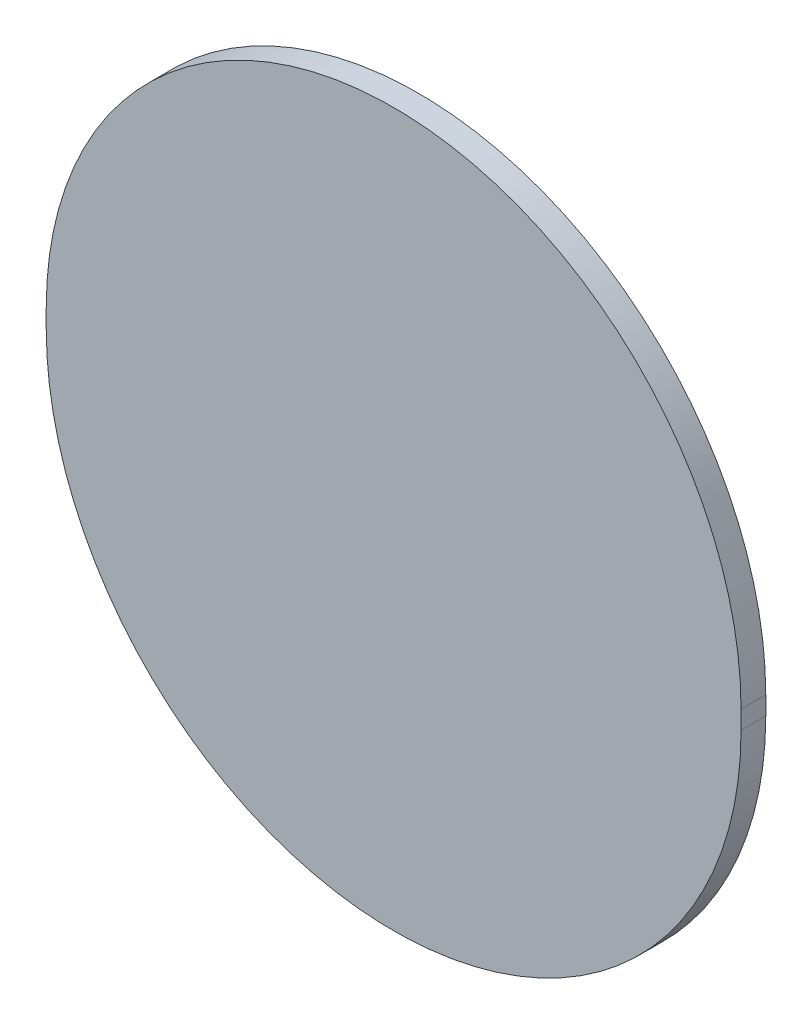
ISO-10303-21;
HEADER;
FILE_DESCRIPTION(('STEP AP214'),'2;1');
FILE_NAME('part.step','',(''),(''),'','','');
FILE_SCHEMA(('AUTOMOTIVE_DESIGN { 1 0 10303 214 1 1 1 1 }'));
ENDSEC;
DATA;
#1=APPLICATION_CONTEXT('core data for automotive mechanical design processes');
#2=APPLICATION_PROTOCOL_DEFINITION('international standard','automotive_design',2000,#1);
#3=PRODUCT_CONTEXT('',#1,'mechanical');
#4=PRODUCT('Part','Part','',(#3));
#5=PRODUCT_RELATED_PRODUCT_CATEGORY('part','',(#4));
#6=PRODUCT_DEFINITION_FORMATION('','',#4);
#7=PRODUCT_DEFINITION_CONTEXT('part definition',#1,'design');
#8=PRODUCT_DEFINITION('design','',#6,#7);
#9=PRODUCT_DEFINITION_SHAPE('','',#8);
#10=(LENGTH_UNIT() NAMED_UNIT(*) SI_UNIT(.MILLI.,.METRE.));
#11=(NAMED_UNIT(*) PLANE_ANGLE_UNIT() SI_UNIT($,.RADIAN.));
#12=(NAMED_UNIT(*) SI_UNIT($,.STERADIAN.) SOLID_ANGLE_UNIT());
#13=UNCERTAINTY_MEASURE_WITH_UNIT(LENGTH_MEASURE(1.E-05),#10,'distance_accuracy_value','');
#14=(GEOMETRIC_REPRESENTATION_CONTEXT(3) GLOBAL_UNCERTAINTY_ASSIGNED_CONTEXT((#13)) GLOBAL_UNIT_ASSIGNED_CONTEXT((#10,
#11,#12)) REPRESENTATION_CONTEXT('',''));
#15=CARTESIAN_POINT('',(0.,0.,0.));
#16=DIRECTION('',(0.,0.,1.));
#17=DIRECTION('',(1.,0.,0.));
#18=AXIS2_PLACEMENT_3D('',#15,#16,#17);
#19=CARTESIAN_POINT('',(50.1149874,118.064026,0.));
#20=DIRECTION('',(-1.,0.,0.));
#21=DIRECTION('',(0.,1.,0.));
#22=AXIS2_PLACEMENT_3D('',#19,#20,#21);
#23=PLANE('',#22);
#24=DIRECTION('',(0.,1.,0.));
#25=VECTOR('',#24,1.);
#26=CARTESIAN_POINT('',(50.1149874,118.064026,0.03556));
#27=LINE('',#26,#25);
#28=CARTESIAN_POINT('',(50.1149874,118.064026,0.03556));
#29=VERTEX_POINT('',#28);
#30=CARTESIAN_POINT('',(50.1149874,118.0903404,0.03556));
#31=VERTEX_POINT('',#30);
#32=EDGE_CURVE('E11',#29,#31,#27,.T.);
#33=ORIENTED_EDGE('',*,*,#32,.F.);
#34=DIRECTION('',(0.,0.,1.));
#35=VECTOR('',#34,1.);
#36=CARTESIAN_POINT('',(50.1149874,118.064026,0.));
#37=LINE('',#36,#35);
#38=CARTESIAN_POINT('',(50.1149874,118.064026,0.));
#39=VERTEX_POINT('',#38);
#40=EDGE_CURVE('E24',#39,#29,#37,.T.);
#41=ORIENTED_EDGE('',*,*,#40,.F.);
#42=DIRECTION('',(0.,1.,0.));
#43=VECTOR('',#42,1.);
#44=CARTESIAN_POINT('',(50.1149874,118.064026,0.));
#45=LINE('',#44,#43);
#46=CARTESIAN_POINT('',(50.1149874,118.0903404,0.));
#47=VERTEX_POINT('',#46);
#48=EDGE_CURVE('E75',#39,#47,#45,.T.);
#49=ORIENTED_EDGE('',*,*,#48,.T.);
#50=DIRECTION('',(0.,0.,1.));
#51=VECTOR('',#50,1.);
#52=CARTESIAN_POINT('',(50.1149874,118.0903404,0.));
#53=LINE('',#52,#51);
#54=EDGE_CURVE('E37',#47,#31,#53,.T.);
#55=ORIENTED_EDGE('',*,*,#54,.T.);
#56=EDGE_LOOP('',(#33,#41,#49,#55));
#57=FACE_BOUND('',#56,.T.);
#58=ADVANCED_FACE('F17',(#57),#23,.F.);
#59=CARTESIAN_POINT('',(49.6149884,118.0903404,0.));
#60=DIRECTION('',(0.,0.,-1.));
#61=DIRECTION('',(1.,0.,0.));
#62=AXIS2_PLACEMENT_3D('',#59,#60,#61);
#63=CYLINDRICAL_SURFACE('',#62,0.499999);
#64=CARTESIAN_POINT('',(49.6149884,118.0903404,0.03556));
#65=DIRECTION('',(0.,0.,1.));
#66=DIRECTION('',(1.,0.,0.));
#67=AXIS2_PLACEMENT_3D('',#64,#65,#66);
#68=CIRCLE('',#67,0.499999);
#69=CARTESIAN_POINT('',(49.1149894,118.0903404,0.03556));
#70=VERTEX_POINT('',#69);
#71=EDGE_CURVE('E83',#31,#70,#68,.T.);
#72=ORIENTED_EDGE('',*,*,#71,.F.);
#73=ORIENTED_EDGE('',*,*,#54,.F.);
#74=CARTESIAN_POINT('',(49.6149884,118.0903404,0.));
#75=DIRECTION('',(0.,0.,1.));
#76=DIRECTION('',(1.,0.,0.));
#77=AXIS2_PLACEMENT_3D('',#74,#75,#76);
#78=CIRCLE('',#77,0.499999);
#79=CARTESIAN_POINT('',(49.1149894,118.0903404,0.));
#80=VERTEX_POINT('',#79);
#81=EDGE_CURVE('E81',#47,#80,#78,.T.);
#82=ORIENTED_EDGE('',*,*,#81,.T.);
#83=DIRECTION('',(0.,0.,1.));
#84=VECTOR('',#83,1.);
#85=CARTESIAN_POINT('',(49.1149894,118.0903404,0.));
#86=LINE('',#85,#84);
#87=EDGE_CURVE('E67',#80,#70,#86,.T.);
#88=ORIENTED_EDGE('',*,*,#87,.T.);
#89=EDGE_LOOP('',(#72,#73,#82,#88));
#90=FACE_BOUND('',#89,.T.);
#91=ADVANCED_FACE('F89',(#90),#63,.T.);
#92=CARTESIAN_POINT('',(49.1149894,118.0903404,0.));
#93=DIRECTION('',(1.,0.,0.));
#94=DIRECTION('',(0.,-1.,0.));
#95=AXIS2_PLACEMENT_3D('',#92,#93,#94);
#96=PLANE('',#95);
#97=DIRECTION('',(0.,-1.,0.));
#98=VECTOR('',#97,1.);
#99=CARTESIAN_POINT('',(49.1149894,118.0903404,0.03556));
#100=LINE('',#99,#98);
#101=CARTESIAN_POINT('',(49.1149894,118.064026,0.03556));
#102=VERTEX_POINT('',#101);
#103=EDGE_CURVE('E71',#70,#102,#100,.T.);
#104=ORIENTED_EDGE('',*,*,#103,.F.);
#105=ORIENTED_EDGE('',*,*,#87,.F.);
#106=DIRECTION('',(0.,-1.,0.));
#107=VECTOR('',#106,1.);
#108=CARTESIAN_POINT('',(49.1149894,118.0903404,0.));
#109=LINE('',#108,#107);
#110=CARTESIAN_POINT('',(49.1149894,118.064026,0.));
#111=VERTEX_POINT('',#110);
#112=EDGE_CURVE('E63',#80,#111,#109,.T.);
#113=ORIENTED_EDGE('',*,*,#112,.T.);
#114=DIRECTION('',(0.,0.,1.));
#115=VECTOR('',#114,1.);
#116=CARTESIAN_POINT('',(49.1149894,118.064026,0.));
#117=LINE('',#116,#115);
#118=EDGE_CURVE('E53',#111,#102,#117,.T.);
#119=ORIENTED_EDGE('',*,*,#118,.T.);
#120=EDGE_LOOP('',(#104,#105,#113,#119));
#121=FACE_BOUND('',#120,.T.);
#122=ADVANCED_FACE('F66',(#121),#96,.F.);
#123=CARTESIAN_POINT('',(49.6149884,118.064026,0.));
#124=DIRECTION('',(0.,0.,-1.));
#125=DIRECTION('',(-1.,0.,0.));
#126=AXIS2_PLACEMENT_3D('',#123,#124,#125);
#127=CYLINDRICAL_SURFACE('',#126,0.499999);
#128=CARTESIAN_POINT('',(49.6149884,118.064026,0.03556));
#129=DIRECTION('',(0.,0.,1.));
#130=DIRECTION('',(-1.,0.,0.));
#131=AXIS2_PLACEMENT_3D('',#128,#129,#130);
#132=CIRCLE('',#131,0.499999);
#133=EDGE_CURVE('E59',#102,#29,#132,.T.);
#134=ORIENTED_EDGE('',*,*,#133,.F.);
#135=ORIENTED_EDGE('',*,*,#118,.F.);
#136=CARTESIAN_POINT('',(49.6149884,118.064026,0.));
#137=DIRECTION('',(0.,0.,1.));
#138=DIRECTION('',(-1.,0.,0.));
#139=AXIS2_PLACEMENT_3D('',#136,#137,#138);
#140=CIRCLE('',#139,0.499999);
#141=EDGE_CURVE('E57',#111,#39,#140,.T.);
#142=ORIENTED_EDGE('',*,*,#141,.T.);
#143=ORIENTED_EDGE('',*,*,#40,.T.);
#144=EDGE_LOOP('',(#134,#135,#142,#143));
#145=FACE_BOUND('',#144,.T.);
#146=ADVANCED_FACE('F55',(#145),#127,.T.);
#147=CARTESIAN_POINT('',(50.1149874,118.064026,0.));
#148=DIRECTION('',(0.,0.,-1.));
#149=DIRECTION('',(-1.,0.,0.));
#150=AXIS2_PLACEMENT_3D('',#147,#148,#149);
#151=PLANE('',#150);
#152=ORIENTED_EDGE('',*,*,#141,.F.);
#153=ORIENTED_EDGE('',*,*,#112,.F.);
#154=ORIENTED_EDGE('',*,*,#81,.F.);
#155=ORIENTED_EDGE('',*,*,#48,.F.);
#156=EDGE_LOOP('',(#152,#153,#154,#155));
#157=FACE_BOUND('',#156,.T.);
#158=ADVANCED_FACE('F74',(#157),#151,.T.);
#159=CARTESIAN_POINT('',(50.1149874,118.064026,0.03556));
#160=DIRECTION('',(0.,0.,-1.));
#161=DIRECTION('',(-1.,0.,0.));
#162=AXIS2_PLACEMENT_3D('',#159,#160,#161);
#163=PLANE('',#162);
#164=ORIENTED_EDGE('',*,*,#32,.T.);
#165=ORIENTED_EDGE('',*,*,#71,.T.);
#166=ORIENTED_EDGE('',*,*,#103,.T.);
#167=ORIENTED_EDGE('',*,*,#133,.T.);
#168=EDGE_LOOP('',(#164,#165,#166,#167));
#169=FACE_BOUND('',#168,.T.);
#170=ADVANCED_FACE('F91',(#169),#163,.F.);
#171=CLOSED_SHELL('',(#58,#91,#122,#146,#158,#170));
#172=MANIFOLD_SOLID_BREP('B1',#171);
#173=ADVANCED_BREP_SHAPE_REPRESENTATION('',(#18,#172),#14);
#174=SHAPE_DEFINITION_REPRESENTATION(#9,#173);
ENDSEC;
END-ISO-10303-21;
